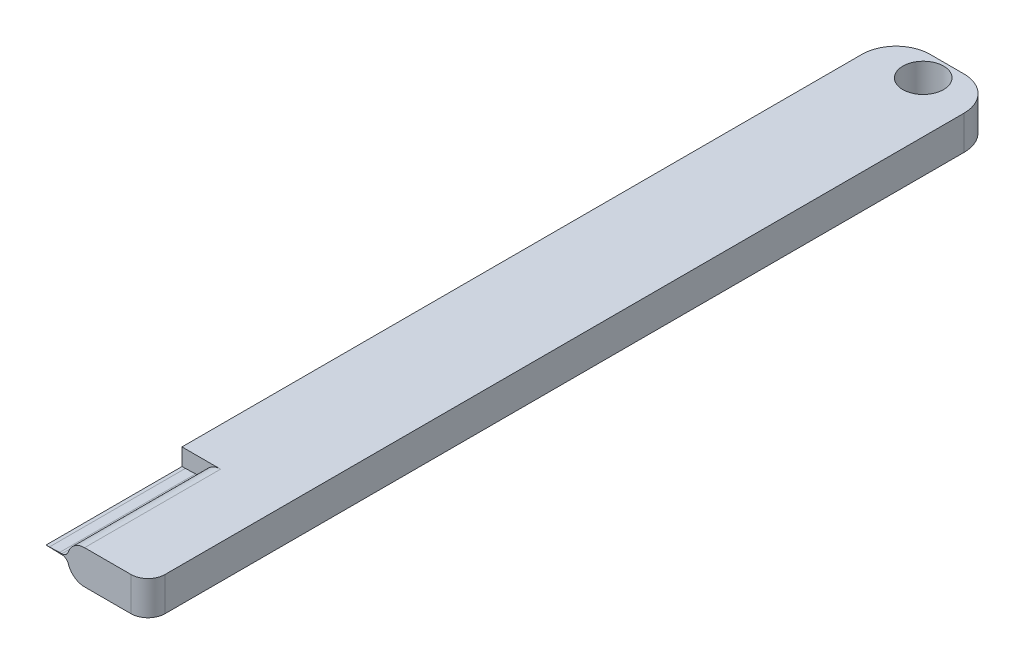
ISO-10303-21;
HEADER;
FILE_DESCRIPTION(('STEP AP214'),'2;1');
FILE_NAME('part.step','',(''),(''),'','','');
FILE_SCHEMA(('AUTOMOTIVE_DESIGN { 1 0 10303 214 1 1 1 1 }'));
ENDSEC;
DATA;
#1=APPLICATION_CONTEXT('core data for automotive mechanical design processes');
#2=APPLICATION_PROTOCOL_DEFINITION('international standard','automotive_design',2000,#1);
#3=PRODUCT_CONTEXT('',#1,'mechanical');
#4=PRODUCT('Part','Part','',(#3));
#5=PRODUCT_RELATED_PRODUCT_CATEGORY('part','',(#4));
#6=PRODUCT_DEFINITION_FORMATION('','',#4);
#7=PRODUCT_DEFINITION_CONTEXT('part definition',#1,'design');
#8=PRODUCT_DEFINITION('design','',#6,#7);
#9=PRODUCT_DEFINITION_SHAPE('','',#8);
#10=(LENGTH_UNIT() NAMED_UNIT(*) SI_UNIT(.MILLI.,.METRE.));
#11=(NAMED_UNIT(*) PLANE_ANGLE_UNIT() SI_UNIT($,.RADIAN.));
#12=(NAMED_UNIT(*) SI_UNIT($,.STERADIAN.) SOLID_ANGLE_UNIT());
#13=UNCERTAINTY_MEASURE_WITH_UNIT(LENGTH_MEASURE(1.E-05),#10,'distance_accuracy_value','');
#14=(GEOMETRIC_REPRESENTATION_CONTEXT(3) GLOBAL_UNCERTAINTY_ASSIGNED_CONTEXT((#13)) GLOBAL_UNIT_ASSIGNED_CONTEXT((#10,
#11,#12)) REPRESENTATION_CONTEXT('',''));
#15=CARTESIAN_POINT('',(0.,0.,0.));
#16=DIRECTION('',(0.,0.,1.));
#17=DIRECTION('',(1.,0.,0.));
#18=AXIS2_PLACEMENT_3D('',#15,#16,#17);
#19=CARTESIAN_POINT('',(0.,0.,250.));
#20=DIRECTION('',(1.,0.,0.));
#21=DIRECTION('',(0.,0.,-1.));
#22=AXIS2_PLACEMENT_3D('',#19,#20,#21);
#23=PLANE('',#22);
#24=DIRECTION('',(0.,-1.,0.));
#25=VECTOR('',#24,1.);
#26=CARTESIAN_POINT('',(0.,0.,210.));
#27=LINE('',#26,#25);
#28=CARTESIAN_POINT('',(0.,5.,210.));
#29=VERTEX_POINT('',#28);
#30=CARTESIAN_POINT('',(0.,0.,210.));
#31=VERTEX_POINT('',#30);
#32=EDGE_CURVE('E207',#29,#31,#27,.T.);
#33=ORIENTED_EDGE('',*,*,#32,.F.);
#34=DIRECTION('',(0.,-1.,0.));
#35=VECTOR('',#34,1.);
#36=CARTESIAN_POINT('',(0.,0.,210.));
#37=LINE('',#36,#35);
#38=CARTESIAN_POINT('',(0.,10.,210.));
#39=VERTEX_POINT('',#38);
#40=EDGE_CURVE('E234',#39,#29,#37,.T.);
#41=ORIENTED_EDGE('',*,*,#40,.F.);
#42=DIRECTION('',(0.,0.,-1.));
#43=VECTOR('',#42,1.);
#44=CARTESIAN_POINT('',(0.,10.,250.));
#45=LINE('',#44,#43);
#46=CARTESIAN_POINT('',(0.,10.,10.));
#47=VERTEX_POINT('',#46);
#48=EDGE_CURVE('E284',#39,#47,#45,.T.);
#49=ORIENTED_EDGE('',*,*,#48,.T.);
#50=DIRECTION('',(0.,-1.,0.));
#51=VECTOR('',#50,1.);
#52=CARTESIAN_POINT('',(0.,0.,10.));
#53=LINE('',#52,#51);
#54=CARTESIAN_POINT('',(0.,0.,10.));
#55=VERTEX_POINT('',#54);
#56=EDGE_CURVE('E306',#47,#55,#53,.T.);
#57=ORIENTED_EDGE('',*,*,#56,.T.);
#58=DIRECTION('',(0.,0.,-1.));
#59=VECTOR('',#58,1.);
#60=CARTESIAN_POINT('',(0.,0.,250.));
#61=LINE('',#60,#59);
#62=EDGE_CURVE('E293',#31,#55,#61,.T.);
#63=ORIENTED_EDGE('',*,*,#62,.F.);
#64=EDGE_LOOP('',(#33,#41,#49,#57,#63));
#65=FACE_BOUND('',#64,.T.);
#66=ADVANCED_FACE('F38',(#65),#23,.F.);
#67=CARTESIAN_POINT('',(0.,0.,250.));
#68=DIRECTION('',(0.,1.,0.));
#69=DIRECTION('',(0.,0.,1.));
#70=AXIS2_PLACEMENT_3D('',#67,#68,#69);
#71=PLANE('',#70);
#72=CARTESIAN_POINT('',(15.,0.,7.));
#73=DIRECTION('',(0.,1.,0.));
#74=DIRECTION('',(0.,0.,1.));
#75=AXIS2_PLACEMENT_3D('',#72,#73,#74);
#76=CIRCLE('',#75,6.);
#77=CARTESIAN_POINT('',(15.,0.,13.));
#78=VERTEX_POINT('',#77);
#79=EDGE_CURVE('E274',#78,#78,#76,.T.);
#80=ORIENTED_EDGE('',*,*,#79,.T.);
#81=EDGE_LOOP('',(#80));
#82=FACE_BOUND('',#81,.T.);
#83=DIRECTION('',(0.,0.,-1.));
#84=VECTOR('',#83,1.);
#85=CARTESIAN_POINT('',(30.,0.,250.));
#86=LINE('',#85,#84);
#87=CARTESIAN_POINT('',(30.,0.,245.));
#88=VERTEX_POINT('',#87);
#89=CARTESIAN_POINT('',(30.,0.,10.));
#90=VERTEX_POINT('',#89);
#91=EDGE_CURVE('E291',#88,#90,#86,.T.);
#92=ORIENTED_EDGE('',*,*,#91,.F.);
#93=CARTESIAN_POINT('',(25.,0.,245.));
#94=DIRECTION('',(0.,1.,0.));
#95=DIRECTION('',(0.,0.,1.));
#96=AXIS2_PLACEMENT_3D('',#93,#94,#95);
#97=CIRCLE('',#96,5.);
#98=CARTESIAN_POINT('',(25.,0.,250.));
#99=VERTEX_POINT('',#98);
#100=EDGE_CURVE('E12',#88,#99,#97,.F.);
#101=ORIENTED_EDGE('',*,*,#100,.T.);
#102=DIRECTION('',(1.,0.,0.));
#103=VECTOR('',#102,1.);
#104=CARTESIAN_POINT('',(0.,0.,250.));
#105=LINE('',#104,#103);
#106=CARTESIAN_POINT('',(11.3447097371996,0.,250.));
#107=VERTEX_POINT('',#106);
#108=EDGE_CURVE('E278',#107,#99,#105,.T.);
#109=ORIENTED_EDGE('',*,*,#108,.F.);
#110=DIRECTION('',(0.,0.,1.));
#111=VECTOR('',#110,1.);
#112=CARTESIAN_POINT('',(11.3447097371996,0.,210.));
#113=LINE('',#112,#111);
#114=CARTESIAN_POINT('',(11.3447097371996,0.,210.));
#115=VERTEX_POINT('',#114);
#116=EDGE_CURVE('E331',#107,#115,#113,.F.);
#117=ORIENTED_EDGE('',*,*,#116,.T.);
#118=DIRECTION('',(1.,0.,0.));
#119=VECTOR('',#118,1.);
#120=CARTESIAN_POINT('',(0.,0.,210.));
#121=LINE('',#120,#119);
#122=EDGE_CURVE('E209',#31,#115,#121,.T.);
#123=ORIENTED_EDGE('',*,*,#122,.F.);
#124=ORIENTED_EDGE('',*,*,#62,.T.);
#125=CARTESIAN_POINT('',(10.,0.,10.));
#126=DIRECTION('',(0.,1.,0.));
#127=DIRECTION('',(0.,0.,1.));
#128=AXIS2_PLACEMENT_3D('',#125,#126,#127);
#129=CIRCLE('',#128,10.);
#130=CARTESIAN_POINT('',(10.,0.,0.));
#131=VERTEX_POINT('',#130);
#132=EDGE_CURVE('E309',#55,#131,#129,.F.);
#133=ORIENTED_EDGE('',*,*,#132,.T.);
#134=DIRECTION('',(1.,0.,0.));
#135=VECTOR('',#134,1.);
#136=CARTESIAN_POINT('',(0.,0.,0.));
#137=LINE('',#136,#135);
#138=CARTESIAN_POINT('',(20.,0.,0.));
#139=VERTEX_POINT('',#138);
#140=EDGE_CURVE('E277',#131,#139,#137,.T.);
#141=ORIENTED_EDGE('',*,*,#140,.T.);
#142=CARTESIAN_POINT('',(20.,0.,10.));
#143=DIRECTION('',(0.,1.,0.));
#144=DIRECTION('',(0.,0.,1.));
#145=AXIS2_PLACEMENT_3D('',#142,#143,#144);
#146=CIRCLE('',#145,10.);
#147=EDGE_CURVE('E303',#139,#90,#146,.F.);
#148=ORIENTED_EDGE('',*,*,#147,.T.);
#149=EDGE_LOOP('',(#92,#101,#109,#117,#123,#124,#133,#141,#148));
#150=FACE_BOUND('',#149,.T.);
#151=ADVANCED_FACE('F387',(#82,#150),#71,.F.);
#152=CARTESIAN_POINT('',(0.,0.,250.));
#153=DIRECTION('',(0.,0.,-1.));
#154=DIRECTION('',(-1.,0.,0.));
#155=AXIS2_PLACEMENT_3D('',#152,#153,#154);
#156=PLANE('',#155);
#157=ORIENTED_EDGE('',*,*,#108,.T.);
#158=DIRECTION('',(0.,1.,0.));
#159=VECTOR('',#158,1.);
#160=CARTESIAN_POINT('',(25.,0.,250.));
#161=LINE('',#160,#159);
#162=CARTESIAN_POINT('',(25.,10.,250.));
#163=VERTEX_POINT('',#162);
#164=EDGE_CURVE('E336',#99,#163,#161,.T.);
#165=ORIENTED_EDGE('',*,*,#164,.T.);
#166=DIRECTION('',(-1.,0.,0.));
#167=VECTOR('',#166,1.);
#168=CARTESIAN_POINT('',(0.,10.,250.));
#169=LINE('',#168,#167);
#170=CARTESIAN_POINT('',(11.3447097371996,10.,250.));
#171=VERTEX_POINT('',#170);
#172=EDGE_CURVE('E281',#163,#171,#169,.T.);
#173=ORIENTED_EDGE('',*,*,#172,.T.);
#174=CARTESIAN_POINT('',(11.3447097371996,5.,250.));
#175=DIRECTION('',(0.,0.,-1.));
#176=DIRECTION('',(-1.,0.,0.));
#177=AXIS2_PLACEMENT_3D('',#174,#175,#176);
#178=CIRCLE('',#177,5.);
#179=CARTESIAN_POINT('',(6.72329590798891,6.90854243316196,250.));
#180=VERTEX_POINT('',#179);
#181=EDGE_CURVE('E319',#171,#180,#178,.F.);
#182=ORIENTED_EDGE('',*,*,#181,.T.);
#183=DIRECTION('',(0.381708486632391,0.924282765842147,0.));
#184=VECTOR('',#183,1.);
#185=CARTESIAN_POINT('',(3.30632329216241,-1.36543891848815,250.));
#186=LINE('',#185,#184);
#187=CARTESIAN_POINT('',(6.50109412658494,6.370494985218,250.));
#188=VERTEX_POINT('',#187);
#189=EDGE_CURVE('E249',#188,#180,#186,.T.);
#190=ORIENTED_EDGE('',*,*,#189,.F.);
#191=CARTESIAN_POINT('',(4.65252859490065,7.13391195848279,250.));
#192=DIRECTION('',(0.,0.,1.));
#193=DIRECTION('',(1.,0.,0.));
#194=AXIS2_PLACEMENT_3D('',#191,#192,#193);
#195=CIRCLE('',#194,2.);
#196=CARTESIAN_POINT('',(4.68743340777521,5.13421656817001,250.));
#197=VERTEX_POINT('',#196);
#198=EDGE_CURVE('E222',#188,#197,#195,.F.);
#199=ORIENTED_EDGE('',*,*,#198,.T.);
#200=DIRECTION('',(0.999847695156391,0.0174524064372842,0.));
#201=VECTOR('',#200,1.);
#202=CARTESIAN_POINT('',(-0.0881630582044883,5.05085822178536,250.));
#203=LINE('',#202,#201);
#204=CARTESIAN_POINT('',(4.,5.12221737340346,250.));
#205=VERTEX_POINT('',#204);
#206=EDGE_CURVE('E229',#205,#197,#203,.T.);
#207=ORIENTED_EDGE('',*,*,#206,.F.);
#208=DIRECTION('',(0.999390827019096,0.0348994967025018,0.));
#209=VECTOR('',#208,1.);
#210=CARTESIAN_POINT('',(-0.173782011379413,4.97646569387528,250.));
#211=LINE('',#210,#209);
#212=CARTESIAN_POINT('',(1.,5.01745506492822,250.));
#213=VERTEX_POINT('',#212);
#214=EDGE_CURVE('E255',#213,#205,#211,.T.);
#215=ORIENTED_EDGE('',*,*,#214,.F.);
#216=DIRECTION('',(0.999847695156391,0.0174524064372837,0.));
#217=VECTOR('',#216,1.);
#218=CARTESIAN_POINT('',(-0.0872487417562532,4.99847706754774,250.));
#219=LINE('',#218,#217);
#220=CARTESIAN_POINT('',(0.,5.,250.));
#221=VERTEX_POINT('',#220);
#222=EDGE_CURVE('E252',#221,#213,#219,.T.);
#223=ORIENTED_EDGE('',*,*,#222,.F.);
#224=DIRECTION('',(0.999847695156391,-0.0174524064372837,0.));
#225=VECTOR('',#224,1.);
#226=CARTESIAN_POINT('',(0.0872487417562532,4.99847706754774,250.));
#227=LINE('',#226,#225);
#228=CARTESIAN_POINT('',(1.,4.98254493507178,250.));
#229=VERTEX_POINT('',#228);
#230=EDGE_CURVE('E201',#221,#229,#227,.T.);
#231=ORIENTED_EDGE('',*,*,#230,.T.);
#232=DIRECTION('',(0.999390827019096,-0.0348994967025018,0.));
#233=VECTOR('',#232,1.);
#234=CARTESIAN_POINT('',(0.175000357341222,5.01135455742384,250.));
#235=LINE('',#234,#233);
#236=CARTESIAN_POINT('',(4.,4.87778262659654,250.));
#237=VERTEX_POINT('',#236);
#238=EDGE_CURVE('E215',#229,#237,#235,.T.);
#239=ORIENTED_EDGE('',*,*,#238,.T.);
#240=DIRECTION('',(0.999847695156391,-0.0174524064372854,0.));
#241=VECTOR('',#240,1.);
#242=CARTESIAN_POINT('',(0.0863344253080293,4.94609591331012,250.));
#243=LINE('',#242,#241);
#244=CARTESIAN_POINT('',(4.68743340777521,4.86578343182999,250.));
#245=VERTEX_POINT('',#244);
#246=EDGE_CURVE('E213',#237,#245,#243,.T.);
#247=ORIENTED_EDGE('',*,*,#246,.T.);
#248=CARTESIAN_POINT('',(4.65252859490065,2.86608804151721,250.));
#249=DIRECTION('',(0.,0.,1.));
#250=DIRECTION('',(1.,0.,0.));
#251=AXIS2_PLACEMENT_3D('',#248,#249,#250);
#252=CIRCLE('',#251,2.);
#253=CARTESIAN_POINT('',(6.50109412658494,3.629505014782,250.));
#254=VERTEX_POINT('',#253);
#255=EDGE_CURVE('E192',#245,#254,#252,.F.);
#256=ORIENTED_EDGE('',*,*,#255,.T.);
#257=DIRECTION('',(0.381708486632391,-0.924282765842147,0.));
#258=VECTOR('',#257,1.);
#259=CARTESIAN_POINT('',(6.83438904986248,2.82245260616006,250.));
#260=LINE('',#259,#258);
#261=CARTESIAN_POINT('',(6.7232959079889,3.09145756683804,250.));
#262=VERTEX_POINT('',#261);
#263=EDGE_CURVE('E198',#254,#262,#260,.T.);
#264=ORIENTED_EDGE('',*,*,#263,.T.);
#265=CARTESIAN_POINT('',(11.3447097371996,5.,250.));
#266=DIRECTION('',(0.,0.,-1.));
#267=DIRECTION('',(-1.,0.,0.));
#268=AXIS2_PLACEMENT_3D('',#265,#266,#267);
#269=CIRCLE('',#268,5.);
#270=EDGE_CURVE('E329',#262,#107,#269,.F.);
#271=ORIENTED_EDGE('',*,*,#270,.T.);
#272=EDGE_LOOP('',(#157,#165,#173,#182,#190,#199,#207,#215,#223,#231,#239,#247,#256,#264,#271));
#273=FACE_BOUND('',#272,.T.);
#274=ADVANCED_FACE('F341',(#273),#156,.F.);
#275=CARTESIAN_POINT('',(30.,0.,250.));
#276=DIRECTION('',(-1.,0.,0.));
#277=DIRECTION('',(0.,0.,1.));
#278=AXIS2_PLACEMENT_3D('',#275,#276,#277);
#279=PLANE('',#278);
#280=DIRECTION('',(0.,0.,-1.));
#281=VECTOR('',#280,1.);
#282=CARTESIAN_POINT('',(30.,10.,250.));
#283=LINE('',#282,#281);
#284=CARTESIAN_POINT('',(30.,10.,245.));
#285=VERTEX_POINT('',#284);
#286=CARTESIAN_POINT('',(30.,10.,10.));
#287=VERTEX_POINT('',#286);
#288=EDGE_CURVE('E289',#285,#287,#283,.T.);
#289=ORIENTED_EDGE('',*,*,#288,.F.);
#290=DIRECTION('',(0.,1.,0.));
#291=VECTOR('',#290,1.);
#292=CARTESIAN_POINT('',(30.,0.,245.));
#293=LINE('',#292,#291);
#294=EDGE_CURVE('E46',#285,#88,#293,.F.);
#295=ORIENTED_EDGE('',*,*,#294,.T.);
#296=ORIENTED_EDGE('',*,*,#91,.T.);
#297=DIRECTION('',(0.,1.,0.));
#298=VECTOR('',#297,1.);
#299=CARTESIAN_POINT('',(30.,10.,10.));
#300=LINE('',#299,#298);
#301=EDGE_CURVE('E295',#90,#287,#300,.T.);
#302=ORIENTED_EDGE('',*,*,#301,.T.);
#303=EDGE_LOOP('',(#289,#295,#296,#302));
#304=FACE_BOUND('',#303,.T.);
#305=ADVANCED_FACE('F402',(#304),#279,.F.);
#306=CARTESIAN_POINT('',(0.,10.,250.));
#307=DIRECTION('',(0.,-1.,0.));
#308=DIRECTION('',(0.,0.,-1.));
#309=AXIS2_PLACEMENT_3D('',#306,#307,#308);
#310=PLANE('',#309);
#311=CARTESIAN_POINT('',(15.,10.,7.));
#312=DIRECTION('',(0.,1.,0.));
#313=DIRECTION('',(0.,0.,1.));
#314=AXIS2_PLACEMENT_3D('',#311,#312,#313);
#315=CIRCLE('',#314,6.);
#316=CARTESIAN_POINT('',(15.,10.,13.));
#317=VERTEX_POINT('',#316);
#318=EDGE_CURVE('E262',#317,#317,#315,.T.);
#319=ORIENTED_EDGE('',*,*,#318,.F.);
#320=EDGE_LOOP('',(#319));
#321=FACE_BOUND('',#320,.T.);
#322=ORIENTED_EDGE('',*,*,#172,.F.);
#323=CARTESIAN_POINT('',(25.,10.,245.));
#324=DIRECTION('',(0.,-1.,0.));
#325=DIRECTION('',(0.,0.,-1.));
#326=AXIS2_PLACEMENT_3D('',#323,#324,#325);
#327=CIRCLE('',#326,5.);
#328=EDGE_CURVE('E60',#163,#285,#327,.F.);
#329=ORIENTED_EDGE('',*,*,#328,.T.);
#330=ORIENTED_EDGE('',*,*,#288,.T.);
#331=CARTESIAN_POINT('',(20.,10.,10.));
#332=DIRECTION('',(0.,-1.,0.));
#333=DIRECTION('',(0.,0.,-1.));
#334=AXIS2_PLACEMENT_3D('',#331,#332,#333);
#335=CIRCLE('',#334,10.);
#336=CARTESIAN_POINT('',(20.,10.,0.));
#337=VERTEX_POINT('',#336);
#338=EDGE_CURVE('E298',#287,#337,#335,.F.);
#339=ORIENTED_EDGE('',*,*,#338,.T.);
#340=DIRECTION('',(-1.,0.,0.));
#341=VECTOR('',#340,1.);
#342=CARTESIAN_POINT('',(0.,10.,0.));
#343=LINE('',#342,#341);
#344=CARTESIAN_POINT('',(10.,10.,0.));
#345=VERTEX_POINT('',#344);
#346=EDGE_CURVE('E282',#337,#345,#343,.T.);
#347=ORIENTED_EDGE('',*,*,#346,.T.);
#348=CARTESIAN_POINT('',(10.,10.,10.));
#349=DIRECTION('',(0.,-1.,0.));
#350=DIRECTION('',(0.,0.,-1.));
#351=AXIS2_PLACEMENT_3D('',#348,#349,#350);
#352=CIRCLE('',#351,10.);
#353=EDGE_CURVE('E313',#345,#47,#352,.F.);
#354=ORIENTED_EDGE('',*,*,#353,.T.);
#355=ORIENTED_EDGE('',*,*,#48,.F.);
#356=DIRECTION('',(-1.,0.,0.));
#357=VECTOR('',#356,1.);
#358=CARTESIAN_POINT('',(0.,10.,210.));
#359=LINE('',#358,#357);
#360=CARTESIAN_POINT('',(11.3447097371996,10.,210.));
#361=VERTEX_POINT('',#360);
#362=EDGE_CURVE('E232',#361,#39,#359,.T.);
#363=ORIENTED_EDGE('',*,*,#362,.F.);
#364=DIRECTION('',(0.,0.,1.));
#365=VECTOR('',#364,1.);
#366=CARTESIAN_POINT('',(11.3447097371996,10.,250.));
#367=LINE('',#366,#365);
#368=EDGE_CURVE('E316',#361,#171,#367,.T.);
#369=ORIENTED_EDGE('',*,*,#368,.T.);
#370=EDGE_LOOP('',(#322,#329,#330,#339,#347,#354,#355,#363,#369));
#371=FACE_BOUND('',#370,.T.);
#372=ADVANCED_FACE('F346',(#321,#371),#310,.F.);
#373=CARTESIAN_POINT('',(0.,0.,0.));
#374=DIRECTION('',(0.,0.,-1.));
#375=DIRECTION('',(-1.,0.,0.));
#376=AXIS2_PLACEMENT_3D('',#373,#374,#375);
#377=PLANE('',#376);
#378=ORIENTED_EDGE('',*,*,#140,.F.);
#379=DIRECTION('',(0.,-1.,0.));
#380=VECTOR('',#379,1.);
#381=CARTESIAN_POINT('',(10.,10.,0.));
#382=LINE('',#381,#380);
#383=EDGE_CURVE('E311',#131,#345,#382,.F.);
#384=ORIENTED_EDGE('',*,*,#383,.T.);
#385=ORIENTED_EDGE('',*,*,#346,.F.);
#386=DIRECTION('',(0.,1.,0.));
#387=VECTOR('',#386,1.);
#388=CARTESIAN_POINT('',(20.,0.,0.));
#389=LINE('',#388,#387);
#390=EDGE_CURVE('E300',#337,#139,#389,.F.);
#391=ORIENTED_EDGE('',*,*,#390,.T.);
#392=EDGE_LOOP('',(#378,#384,#385,#391));
#393=FACE_BOUND('',#392,.T.);
#394=ADVANCED_FACE('F395',(#393),#377,.T.);
#395=CARTESIAN_POINT('',(15.,-20.,7.));
#396=DIRECTION('',(0.,1.,0.));
#397=DIRECTION('',(0.,0.,1.));
#398=AXIS2_PLACEMENT_3D('',#395,#396,#397);
#399=CYLINDRICAL_SURFACE('',#398,6.);
#400=ORIENTED_EDGE('',*,*,#318,.T.);
#401=EDGE_LOOP('',(#400));
#402=FACE_BOUND('',#401,.T.);
#403=ORIENTED_EDGE('',*,*,#79,.F.);
#404=EDGE_LOOP('',(#403));
#405=FACE_BOUND('',#404,.T.);
#406=ADVANCED_FACE('F420',(#402,#405),#399,.F.);
#407=CARTESIAN_POINT('',(20.,0.,10.));
#408=DIRECTION('',(0.,-1.,0.));
#409=DIRECTION('',(0.,0.,-1.));
#410=AXIS2_PLACEMENT_3D('',#407,#408,#409);
#411=CYLINDRICAL_SURFACE('',#410,10.);
#412=ORIENTED_EDGE('',*,*,#147,.F.);
#413=ORIENTED_EDGE('',*,*,#390,.F.);
#414=ORIENTED_EDGE('',*,*,#338,.F.);
#415=ORIENTED_EDGE('',*,*,#301,.F.);
#416=EDGE_LOOP('',(#412,#413,#414,#415));
#417=FACE_BOUND('',#416,.T.);
#418=ADVANCED_FACE('F401',(#417),#411,.T.);
#419=CARTESIAN_POINT('',(10.,0.,10.));
#420=DIRECTION('',(0.,1.,0.));
#421=DIRECTION('',(0.,0.,1.));
#422=AXIS2_PLACEMENT_3D('',#419,#420,#421);
#423=CYLINDRICAL_SURFACE('',#422,10.);
#424=ORIENTED_EDGE('',*,*,#353,.F.);
#425=ORIENTED_EDGE('',*,*,#383,.F.);
#426=ORIENTED_EDGE('',*,*,#132,.F.);
#427=ORIENTED_EDGE('',*,*,#56,.F.);
#428=EDGE_LOOP('',(#424,#425,#426,#427));
#429=FACE_BOUND('',#428,.T.);
#430=ADVANCED_FACE('F392',(#429),#423,.T.);
#431=CARTESIAN_POINT('',(4.65252859490065,7.13391195848279,210.));
#432=DIRECTION('',(0.,0.,1.));
#433=DIRECTION('',(1.,0.,0.));
#434=AXIS2_PLACEMENT_3D('',#431,#432,#433);
#435=CYLINDRICAL_SURFACE('',#434,2.);
#436=ORIENTED_EDGE('',*,*,#198,.F.);
#437=DIRECTION('',(0.,0.,1.));
#438=VECTOR('',#437,1.);
#439=CARTESIAN_POINT('',(6.50109412658494,6.370494985218,210.));
#440=LINE('',#439,#438);
#441=CARTESIAN_POINT('',(6.50109412658494,6.370494985218,210.));
#442=VERTEX_POINT('',#441);
#443=EDGE_CURVE('E246',#442,#188,#440,.T.);
#444=ORIENTED_EDGE('',*,*,#443,.F.);
#445=CARTESIAN_POINT('',(4.65252859490065,7.13391195848279,210.));
#446=DIRECTION('',(0.,0.,1.));
#447=DIRECTION('',(1.,0.,0.));
#448=AXIS2_PLACEMENT_3D('',#445,#446,#447);
#449=CIRCLE('',#448,2.);
#450=CARTESIAN_POINT('',(4.68743340777521,5.13421656817001,210.));
#451=VERTEX_POINT('',#450);
#452=EDGE_CURVE('E226',#442,#451,#449,.F.);
#453=ORIENTED_EDGE('',*,*,#452,.T.);
#454=DIRECTION('',(0.,0.,1.));
#455=VECTOR('',#454,1.);
#456=CARTESIAN_POINT('',(4.68743340777521,5.13421656817001,210.));
#457=LINE('',#456,#455);
#458=EDGE_CURVE('E260',#451,#197,#457,.T.);
#459=ORIENTED_EDGE('',*,*,#458,.T.);
#460=EDGE_LOOP('',(#436,#444,#453,#459));
#461=FACE_BOUND('',#460,.T.);
#462=ADVANCED_FACE('F359',(#461),#435,.F.);
#463=CARTESIAN_POINT('',(-0.0881630582044883,5.05085822178536,210.));
#464=DIRECTION('',(0.0174524064372842,-0.999847695156391,0.));
#465=DIRECTION('',(0.999847695156391,0.0174524064372842,0.));
#466=AXIS2_PLACEMENT_3D('',#463,#464,#465);
#467=PLANE('',#466);
#468=ORIENTED_EDGE('',*,*,#206,.T.);
#469=ORIENTED_EDGE('',*,*,#458,.F.);
#470=DIRECTION('',(0.999847695156391,0.0174524064372842,0.));
#471=VECTOR('',#470,1.);
#472=CARTESIAN_POINT('',(-0.0881630582044883,5.05085822178536,210.));
#473=LINE('',#472,#471);
#474=CARTESIAN_POINT('',(4.,5.12221737340346,210.));
#475=VERTEX_POINT('',#474);
#476=EDGE_CURVE('E243',#475,#451,#473,.T.);
#477=ORIENTED_EDGE('',*,*,#476,.F.);
#478=DIRECTION('',(0.,0.,1.));
#479=VECTOR('',#478,1.);
#480=CARTESIAN_POINT('',(4.,5.12221737340346,210.));
#481=LINE('',#480,#479);
#482=EDGE_CURVE('E263',#475,#205,#481,.T.);
#483=ORIENTED_EDGE('',*,*,#482,.T.);
#484=EDGE_LOOP('',(#468,#469,#477,#483));
#485=FACE_BOUND('',#484,.T.);
#486=ADVANCED_FACE('F366',(#485),#467,.F.);
#487=CARTESIAN_POINT('',(-0.173782011379413,4.97646569387528,210.));
#488=DIRECTION('',(0.0348994967025018,-0.999390827019096,0.));
#489=DIRECTION('',(0.999390827019096,0.0348994967025018,0.));
#490=AXIS2_PLACEMENT_3D('',#487,#488,#489);
#491=PLANE('',#490);
#492=ORIENTED_EDGE('',*,*,#214,.T.);
#493=ORIENTED_EDGE('',*,*,#482,.F.);
#494=DIRECTION('',(0.999390827019096,0.0348994967025018,0.));
#495=VECTOR('',#494,1.);
#496=CARTESIAN_POINT('',(-0.173782011379413,4.97646569387528,210.));
#497=LINE('',#496,#495);
#498=CARTESIAN_POINT('',(1.,5.01745506492822,210.));
#499=VERTEX_POINT('',#498);
#500=EDGE_CURVE('E240',#499,#475,#497,.T.);
#501=ORIENTED_EDGE('',*,*,#500,.F.);
#502=DIRECTION('',(0.,0.,1.));
#503=VECTOR('',#502,1.);
#504=CARTESIAN_POINT('',(1.,5.01745506492822,210.));
#505=LINE('',#504,#503);
#506=EDGE_CURVE('E265',#499,#213,#505,.T.);
#507=ORIENTED_EDGE('',*,*,#506,.T.);
#508=EDGE_LOOP('',(#492,#493,#501,#507));
#509=FACE_BOUND('',#508,.T.);
#510=ADVANCED_FACE('F371',(#509),#491,.F.);
#511=CARTESIAN_POINT('',(-0.0872487417562532,4.99847706754774,210.));
#512=DIRECTION('',(0.0174524064372837,-0.999847695156391,0.));
#513=DIRECTION('',(0.999847695156391,0.0174524064372837,0.));
#514=AXIS2_PLACEMENT_3D('',#511,#512,#513);
#515=PLANE('',#514);
#516=ORIENTED_EDGE('',*,*,#222,.T.);
#517=ORIENTED_EDGE('',*,*,#506,.F.);
#518=DIRECTION('',(0.999847695156391,0.0174524064372837,0.));
#519=VECTOR('',#518,1.);
#520=CARTESIAN_POINT('',(-0.0872487417562532,4.99847706754774,210.));
#521=LINE('',#520,#519);
#522=EDGE_CURVE('E237',#29,#499,#521,.T.);
#523=ORIENTED_EDGE('',*,*,#522,.F.);
#524=DIRECTION('',(0.,0.,1.));
#525=VECTOR('',#524,1.);
#526=CARTESIAN_POINT('',(0.,5.,210.));
#527=LINE('',#526,#525);
#528=EDGE_CURVE('E267',#29,#221,#527,.T.);
#529=ORIENTED_EDGE('',*,*,#528,.T.);
#530=EDGE_LOOP('',(#516,#517,#523,#529));
#531=FACE_BOUND('',#530,.T.);
#532=ADVANCED_FACE('F374',(#531),#515,.F.);
#533=CARTESIAN_POINT('',(3.30632329216241,-1.36543891848815,210.));
#534=DIRECTION('',(0.924282765842147,-0.381708486632391,0.));
#535=DIRECTION('',(0.381708486632391,0.924282765842147,0.));
#536=AXIS2_PLACEMENT_3D('',#533,#534,#535);
#537=PLANE('',#536);
#538=ORIENTED_EDGE('',*,*,#189,.T.);
#539=DIRECTION('',(0.,0.,1.));
#540=VECTOR('',#539,1.);
#541=CARTESIAN_POINT('',(6.7232959079889,6.90854243316196,210.));
#542=LINE('',#541,#540);
#543=CARTESIAN_POINT('',(6.72329590798891,6.90854243316196,210.));
#544=VERTEX_POINT('',#543);
#545=EDGE_CURVE('E321',#180,#544,#542,.F.);
#546=ORIENTED_EDGE('',*,*,#545,.T.);
#547=DIRECTION('',(0.381708486632391,0.924282765842147,0.));
#548=VECTOR('',#547,1.);
#549=CARTESIAN_POINT('',(3.30632329216241,-1.36543891848815,210.));
#550=LINE('',#549,#548);
#551=EDGE_CURVE('E228',#442,#544,#550,.T.);
#552=ORIENTED_EDGE('',*,*,#551,.F.);
#553=ORIENTED_EDGE('',*,*,#443,.T.);
#554=EDGE_LOOP('',(#538,#546,#552,#553));
#555=FACE_BOUND('',#554,.T.);
#556=ADVANCED_FACE('F355',(#555),#537,.F.);
#557=CARTESIAN_POINT('',(0.,0.,210.));
#558=DIRECTION('',(0.,0.,1.));
#559=DIRECTION('',(1.,0.,0.));
#560=AXIS2_PLACEMENT_3D('',#557,#558,#559);
#561=PLANE('',#560);
#562=ORIENTED_EDGE('',*,*,#452,.F.);
#563=ORIENTED_EDGE('',*,*,#551,.T.);
#564=CARTESIAN_POINT('',(11.3447097371996,5.,210.));
#565=DIRECTION('',(0.,0.,1.));
#566=DIRECTION('',(1.,0.,0.));
#567=AXIS2_PLACEMENT_3D('',#564,#565,#566);
#568=CIRCLE('',#567,5.);
#569=EDGE_CURVE('E323',#544,#361,#568,.F.);
#570=ORIENTED_EDGE('',*,*,#569,.T.);
#571=ORIENTED_EDGE('',*,*,#362,.T.);
#572=ORIENTED_EDGE('',*,*,#40,.T.);
#573=ORIENTED_EDGE('',*,*,#522,.T.);
#574=ORIENTED_EDGE('',*,*,#500,.T.);
#575=ORIENTED_EDGE('',*,*,#476,.T.);
#576=EDGE_LOOP('',(#562,#563,#570,#571,#572,#573,#574,#575));
#577=FACE_BOUND('',#576,.T.);
#578=ADVANCED_FACE('F362',(#577),#561,.T.);
#579=CARTESIAN_POINT('',(4.65252859490065,2.86608804151721,210.));
#580=DIRECTION('',(0.,0.,1.));
#581=DIRECTION('',(1.,0.,0.));
#582=AXIS2_PLACEMENT_3D('',#579,#580,#581);
#583=CYLINDRICAL_SURFACE('',#582,2.);
#584=ORIENTED_EDGE('',*,*,#255,.F.);
#585=DIRECTION('',(0.,0.,1.));
#586=VECTOR('',#585,1.);
#587=CARTESIAN_POINT('',(4.68743340777521,4.86578343182999,210.));
#588=LINE('',#587,#586);
#589=CARTESIAN_POINT('',(4.68743340777521,4.86578343182999,210.));
#590=VERTEX_POINT('',#589);
#591=EDGE_CURVE('E177',#590,#245,#588,.T.);
#592=ORIENTED_EDGE('',*,*,#591,.F.);
#593=CARTESIAN_POINT('',(4.65252859490065,2.86608804151721,210.));
#594=DIRECTION('',(0.,0.,1.));
#595=DIRECTION('',(1.,0.,0.));
#596=AXIS2_PLACEMENT_3D('',#593,#594,#595);
#597=CIRCLE('',#596,2.);
#598=CARTESIAN_POINT('',(6.50109412658494,3.629505014782,210.));
#599=VERTEX_POINT('',#598);
#600=EDGE_CURVE('E184',#590,#599,#597,.F.);
#601=ORIENTED_EDGE('',*,*,#600,.T.);
#602=DIRECTION('',(0.,0.,1.));
#603=VECTOR('',#602,1.);
#604=CARTESIAN_POINT('',(6.50109412658494,3.629505014782,210.));
#605=LINE('',#604,#603);
#606=EDGE_CURVE('E220',#599,#254,#605,.T.);
#607=ORIENTED_EDGE('',*,*,#606,.T.);
#608=EDGE_LOOP('',(#584,#592,#601,#607));
#609=FACE_BOUND('',#608,.T.);
#610=ADVANCED_FACE('F188',(#609),#583,.F.);
#611=CARTESIAN_POINT('',(6.83438904986248,2.82245260616006,210.));
#612=DIRECTION('',(-0.924282765842147,-0.381708486632391,0.));
#613=DIRECTION('',(0.381708486632391,-0.924282765842147,0.));
#614=AXIS2_PLACEMENT_3D('',#611,#612,#613);
#615=PLANE('',#614);
#616=DIRECTION('',(0.381708486632391,-0.924282765842147,0.));
#617=VECTOR('',#616,1.);
#618=CARTESIAN_POINT('',(6.83438904986248,2.82245260616006,210.));
#619=LINE('',#618,#617);
#620=CARTESIAN_POINT('',(6.7232959079889,3.09145756683804,210.));
#621=VERTEX_POINT('',#620);
#622=EDGE_CURVE('E194',#599,#621,#619,.T.);
#623=ORIENTED_EDGE('',*,*,#622,.T.);
#624=DIRECTION('',(0.,0.,1.));
#625=VECTOR('',#624,1.);
#626=CARTESIAN_POINT('',(6.7232959079889,3.09145756683804,250.));
#627=LINE('',#626,#625);
#628=EDGE_CURVE('E326',#621,#262,#627,.T.);
#629=ORIENTED_EDGE('',*,*,#628,.T.);
#630=ORIENTED_EDGE('',*,*,#263,.F.);
#631=ORIENTED_EDGE('',*,*,#606,.F.);
#632=EDGE_LOOP('',(#623,#629,#630,#631));
#633=FACE_BOUND('',#632,.T.);
#634=ADVANCED_FACE('F434',(#633),#615,.T.);
#635=CARTESIAN_POINT('',(0.0872487417562532,4.99847706754774,210.));
#636=DIRECTION('',(-0.0174524064372837,-0.999847695156391,0.));
#637=DIRECTION('',(0.999847695156391,-0.0174524064372837,0.));
#638=AXIS2_PLACEMENT_3D('',#635,#636,#637);
#639=PLANE('',#638);
#640=ORIENTED_EDGE('',*,*,#230,.F.);
#641=ORIENTED_EDGE('',*,*,#528,.F.);
#642=DIRECTION('',(0.999847695156391,-0.0174524064372837,0.));
#643=VECTOR('',#642,1.);
#644=CARTESIAN_POINT('',(0.0872487417562532,4.99847706754774,210.));
#645=LINE('',#644,#643);
#646=CARTESIAN_POINT('',(1.,4.98254493507178,210.));
#647=VERTEX_POINT('',#646);
#648=EDGE_CURVE('E205',#29,#647,#645,.T.);
#649=ORIENTED_EDGE('',*,*,#648,.T.);
#650=DIRECTION('',(0.,0.,1.));
#651=VECTOR('',#650,1.);
#652=CARTESIAN_POINT('',(1.,4.98254493507178,210.));
#653=LINE('',#652,#651);
#654=EDGE_CURVE('E223',#647,#229,#653,.T.);
#655=ORIENTED_EDGE('',*,*,#654,.T.);
#656=EDGE_LOOP('',(#640,#641,#649,#655));
#657=FACE_BOUND('',#656,.T.);
#658=ADVANCED_FACE('F377',(#657),#639,.T.);
#659=CARTESIAN_POINT('',(0.175000357341222,5.01135455742384,210.));
#660=DIRECTION('',(-0.0348994967025018,-0.999390827019096,0.));
#661=DIRECTION('',(0.999390827019096,-0.0348994967025018,0.));
#662=AXIS2_PLACEMENT_3D('',#659,#660,#661);
#663=PLANE('',#662);
#664=ORIENTED_EDGE('',*,*,#238,.F.);
#665=ORIENTED_EDGE('',*,*,#654,.F.);
#666=DIRECTION('',(0.999390827019096,-0.0348994967025018,0.));
#667=VECTOR('',#666,1.);
#668=CARTESIAN_POINT('',(0.175000357341222,5.01135455742384,210.));
#669=LINE('',#668,#667);
#670=CARTESIAN_POINT('',(4.,4.87778262659654,210.));
#671=VERTEX_POINT('',#670);
#672=EDGE_CURVE('E183',#647,#671,#669,.T.);
#673=ORIENTED_EDGE('',*,*,#672,.T.);
#674=DIRECTION('',(0.,0.,1.));
#675=VECTOR('',#674,1.);
#676=CARTESIAN_POINT('',(4.,4.87778262659654,210.));
#677=LINE('',#676,#675);
#678=EDGE_CURVE('E179',#671,#237,#677,.T.);
#679=ORIENTED_EDGE('',*,*,#678,.T.);
#680=EDGE_LOOP('',(#664,#665,#673,#679));
#681=FACE_BOUND('',#680,.T.);
#682=ADVANCED_FACE('F431',(#681),#663,.T.);
#683=CARTESIAN_POINT('',(0.0863344253080293,4.94609591331012,210.));
#684=DIRECTION('',(-0.0174524064372854,-0.999847695156391,0.));
#685=DIRECTION('',(0.999847695156391,-0.0174524064372854,0.));
#686=AXIS2_PLACEMENT_3D('',#683,#684,#685);
#687=PLANE('',#686);
#688=ORIENTED_EDGE('',*,*,#246,.F.);
#689=ORIENTED_EDGE('',*,*,#678,.F.);
#690=DIRECTION('',(0.999847695156391,-0.0174524064372854,0.));
#691=VECTOR('',#690,1.);
#692=CARTESIAN_POINT('',(0.0863344253080293,4.94609591331012,210.));
#693=LINE('',#692,#691);
#694=EDGE_CURVE('E173',#671,#590,#693,.T.);
#695=ORIENTED_EDGE('',*,*,#694,.T.);
#696=ORIENTED_EDGE('',*,*,#591,.T.);
#697=EDGE_LOOP('',(#688,#689,#695,#696));
#698=FACE_BOUND('',#697,.T.);
#699=ADVANCED_FACE('F176',(#698),#687,.T.);
#700=CARTESIAN_POINT('',(0.,0.,210.));
#701=DIRECTION('',(0.,0.,1.));
#702=DIRECTION('',(1.,0.,0.));
#703=AXIS2_PLACEMENT_3D('',#700,#701,#702);
#704=PLANE('',#703);
#705=ORIENTED_EDGE('',*,*,#600,.F.);
#706=ORIENTED_EDGE('',*,*,#694,.F.);
#707=ORIENTED_EDGE('',*,*,#672,.F.);
#708=ORIENTED_EDGE('',*,*,#648,.F.);
#709=ORIENTED_EDGE('',*,*,#32,.T.);
#710=ORIENTED_EDGE('',*,*,#122,.T.);
#711=CARTESIAN_POINT('',(11.3447097371996,5.,210.));
#712=DIRECTION('',(0.,0.,1.));
#713=DIRECTION('',(1.,0.,0.));
#714=AXIS2_PLACEMENT_3D('',#711,#712,#713);
#715=CIRCLE('',#714,5.);
#716=EDGE_CURVE('E334',#115,#621,#715,.F.);
#717=ORIENTED_EDGE('',*,*,#716,.T.);
#718=ORIENTED_EDGE('',*,*,#622,.F.);
#719=EDGE_LOOP('',(#705,#706,#707,#708,#709,#710,#717,#718));
#720=FACE_BOUND('',#719,.T.);
#721=ADVANCED_FACE('F196',(#720),#704,.T.);
#722=CARTESIAN_POINT('',(11.3447097371996,5.,250.));
#723=DIRECTION('',(0.,0.,1.));
#724=DIRECTION('',(1.,0.,0.));
#725=AXIS2_PLACEMENT_3D('',#722,#723,#724);
#726=CYLINDRICAL_SURFACE('',#725,5.);
#727=ORIENTED_EDGE('',*,*,#569,.F.);
#728=ORIENTED_EDGE('',*,*,#545,.F.);
#729=ORIENTED_EDGE('',*,*,#181,.F.);
#730=ORIENTED_EDGE('',*,*,#368,.F.);
#731=EDGE_LOOP('',(#727,#728,#729,#730));
#732=FACE_BOUND('',#731,.T.);
#733=ADVANCED_FACE('F351',(#732),#726,.T.);
#734=CARTESIAN_POINT('',(11.3447097371996,5.,210.));
#735=DIRECTION('',(0.,0.,-1.));
#736=DIRECTION('',(-1.,0.,0.));
#737=AXIS2_PLACEMENT_3D('',#734,#735,#736);
#738=CYLINDRICAL_SURFACE('',#737,5.);
#739=ORIENTED_EDGE('',*,*,#716,.F.);
#740=ORIENTED_EDGE('',*,*,#116,.F.);
#741=ORIENTED_EDGE('',*,*,#270,.F.);
#742=ORIENTED_EDGE('',*,*,#628,.F.);
#743=EDGE_LOOP('',(#739,#740,#741,#742));
#744=FACE_BOUND('',#743,.T.);
#745=ADVANCED_FACE('F404',(#744),#738,.T.);
#746=CARTESIAN_POINT('',(25.,0.,245.));
#747=DIRECTION('',(0.,1.,0.));
#748=DIRECTION('',(0.,0.,1.));
#749=AXIS2_PLACEMENT_3D('',#746,#747,#748);
#750=CYLINDRICAL_SURFACE('',#749,5.);
#751=ORIENTED_EDGE('',*,*,#100,.F.);
#752=ORIENTED_EDGE('',*,*,#294,.F.);
#753=ORIENTED_EDGE('',*,*,#328,.F.);
#754=ORIENTED_EDGE('',*,*,#164,.F.);
#755=EDGE_LOOP('',(#751,#752,#753,#754));
#756=FACE_BOUND('',#755,.T.);
#757=ADVANCED_FACE('F40',(#756),#750,.T.);
#758=CLOSED_SHELL('',(#66,#151,#274,#305,#372,#394,#406,#418,#430,#462,#486,#510,#532,#556,#578,
#610,#634,#658,#682,#699,#721,#733,#745,#757));
#759=MANIFOLD_SOLID_BREP('B2',#758);
#760=ADVANCED_BREP_SHAPE_REPRESENTATION('',(#18,#759),#14);
#761=SHAPE_DEFINITION_REPRESENTATION(#9,#760);
ENDSEC;
END-ISO-10303-21;
